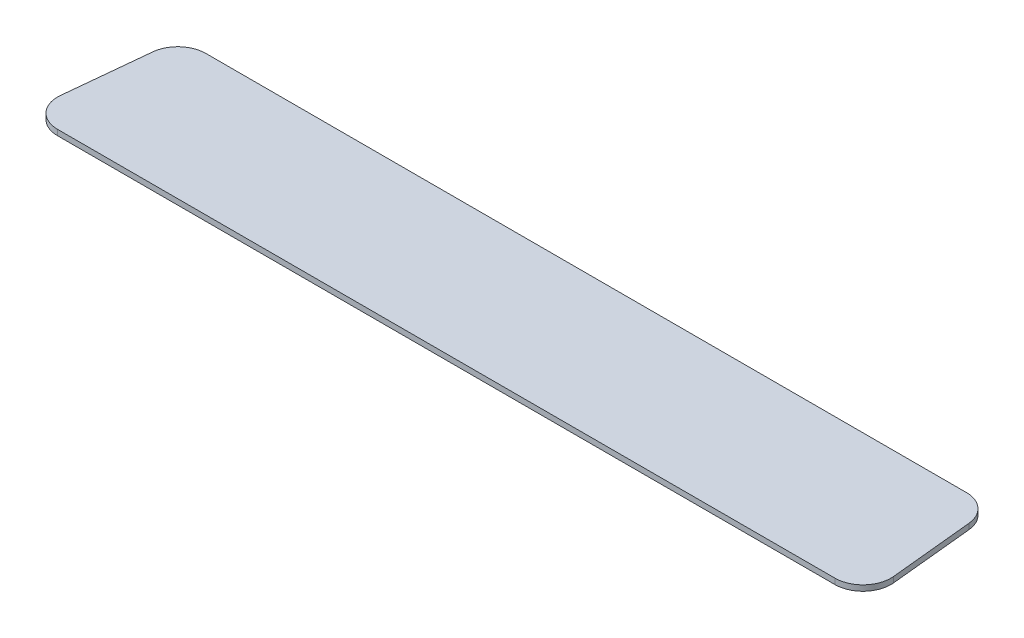
ISO-10303-21;
HEADER;
FILE_DESCRIPTION(('STEP AP214'),'2;1');
FILE_NAME('part.step','',(''),(''),'','','');
FILE_SCHEMA(('AUTOMOTIVE_DESIGN { 1 0 10303 214 1 1 1 1 }'));
ENDSEC;
DATA;
#1=APPLICATION_CONTEXT('core data for automotive mechanical design processes');
#2=APPLICATION_PROTOCOL_DEFINITION('international standard','automotive_design',2000,#1);
#3=PRODUCT_CONTEXT('',#1,'mechanical');
#4=PRODUCT('Part','Part','',(#3));
#5=PRODUCT_RELATED_PRODUCT_CATEGORY('part','',(#4));
#6=PRODUCT_DEFINITION_FORMATION('','',#4);
#7=PRODUCT_DEFINITION_CONTEXT('part definition',#1,'design');
#8=PRODUCT_DEFINITION('design','',#6,#7);
#9=PRODUCT_DEFINITION_SHAPE('','',#8);
#10=(LENGTH_UNIT() NAMED_UNIT(*) SI_UNIT(.MILLI.,.METRE.));
#11=(NAMED_UNIT(*) PLANE_ANGLE_UNIT() SI_UNIT($,.RADIAN.));
#12=(NAMED_UNIT(*) SI_UNIT($,.STERADIAN.) SOLID_ANGLE_UNIT());
#13=UNCERTAINTY_MEASURE_WITH_UNIT(LENGTH_MEASURE(1.E-05),#10,'distance_accuracy_value','');
#14=(GEOMETRIC_REPRESENTATION_CONTEXT(3) GLOBAL_UNCERTAINTY_ASSIGNED_CONTEXT((#13)) GLOBAL_UNIT_ASSIGNED_CONTEXT((#10,
#11,#12)) REPRESENTATION_CONTEXT('',''));
#15=CARTESIAN_POINT('',(0.,0.,0.));
#16=DIRECTION('',(0.,0.,1.));
#17=DIRECTION('',(1.,0.,0.));
#18=AXIS2_PLACEMENT_3D('',#15,#16,#17);
#19=CARTESIAN_POINT('',(138.950124378879,2.,-10.));
#20=DIRECTION('',(0.,-1.,0.));
#21=DIRECTION('',(0.,0.,-1.));
#22=AXIS2_PLACEMENT_3D('',#19,#20,#21);
#23=CYLINDRICAL_SURFACE('',#22,10.);
#24=CARTESIAN_POINT('',(138.950124378879,0.,-10.));
#25=DIRECTION('',(0.,1.,0.));
#26=DIRECTION('',(0.,0.,1.));
#27=AXIS2_PLACEMENT_3D('',#24,#25,#26);
#28=CIRCLE('',#27,10.);
#29=CARTESIAN_POINT('',(138.950124378879,0.,0.));
#30=VERTEX_POINT('',#29);
#31=CARTESIAN_POINT('',(148.900496280979,0.,-10.9950371902101));
#32=VERTEX_POINT('',#31);
#33=EDGE_CURVE('E146',#30,#32,#28,.T.);
#34=ORIENTED_EDGE('',*,*,#33,.T.);
#35=DIRECTION('',(0.,-1.,0.));
#36=VECTOR('',#35,1.);
#37=CARTESIAN_POINT('',(148.900496280979,2.,-10.9950371902101));
#38=LINE('',#37,#36);
#39=CARTESIAN_POINT('',(148.900496280979,2.,-10.9950371902101));
#40=VERTEX_POINT('',#39);
#41=EDGE_CURVE('E11',#40,#32,#38,.T.);
#42=ORIENTED_EDGE('',*,*,#41,.F.);
#43=CARTESIAN_POINT('',(138.950124378879,2.,-10.));
#44=DIRECTION('',(0.,1.,0.));
#45=DIRECTION('',(0.,0.,1.));
#46=AXIS2_PLACEMENT_3D('',#43,#44,#45);
#47=CIRCLE('',#46,10.);
#48=CARTESIAN_POINT('',(138.950124378879,2.,0.));
#49=VERTEX_POINT('',#48);
#50=EDGE_CURVE('E168',#49,#40,#47,.T.);
#51=ORIENTED_EDGE('',*,*,#50,.F.);
#52=DIRECTION('',(0.,-1.,0.));
#53=VECTOR('',#52,1.);
#54=CARTESIAN_POINT('',(138.950124378879,2.,0.));
#55=LINE('',#54,#53);
#56=EDGE_CURVE('E142',#49,#30,#55,.T.);
#57=ORIENTED_EDGE('',*,*,#56,.T.);
#58=EDGE_LOOP('',(#34,#42,#51,#57));
#59=FACE_BOUND('',#58,.T.);
#60=ADVANCED_FACE('F45',(#59),#23,.T.);
#61=CARTESIAN_POINT('',(145.900496280979,2.,-40.9950371902099));
#62=DIRECTION('',(-0.995037190209989,0.,0.0995037190209986));
#63=DIRECTION('',(0.0995037190209986,0.,0.995037190209989));
#64=AXIS2_PLACEMENT_3D('',#61,#62,#63);
#65=PLANE('',#64);
#66=DIRECTION('',(-0.0995037190209985,0.,-0.995037190209989));
#67=VECTOR('',#66,1.);
#68=CARTESIAN_POINT('',(145.900496280979,0.,-40.9950371902099));
#69=LINE('',#68,#67);
#70=CARTESIAN_POINT('',(145.900496280979,0.,-40.9950371902099));
#71=VERTEX_POINT('',#70);
#72=EDGE_CURVE('E150',#32,#71,#69,.T.);
#73=ORIENTED_EDGE('',*,*,#72,.T.);
#74=DIRECTION('',(0.,-1.,0.));
#75=VECTOR('',#74,1.);
#76=CARTESIAN_POINT('',(145.900496280979,2.,-40.9950371902099));
#77=LINE('',#76,#75);
#78=CARTESIAN_POINT('',(145.900496280979,2.,-40.9950371902099));
#79=VERTEX_POINT('',#78);
#80=EDGE_CURVE('E54',#79,#71,#77,.T.);
#81=ORIENTED_EDGE('',*,*,#80,.F.);
#82=DIRECTION('',(-0.0995037190209985,0.,-0.995037190209989));
#83=VECTOR('',#82,1.);
#84=CARTESIAN_POINT('',(145.900496280979,2.,-40.9950371902099));
#85=LINE('',#84,#83);
#86=EDGE_CURVE('E105',#40,#79,#85,.T.);
#87=ORIENTED_EDGE('',*,*,#86,.F.);
#88=ORIENTED_EDGE('',*,*,#41,.T.);
#89=EDGE_LOOP('',(#73,#81,#87,#88));
#90=FACE_BOUND('',#89,.T.);
#91=ADVANCED_FACE('F214',(#90),#65,.F.);
#92=CARTESIAN_POINT('',(135.950124378879,2.,-40.));
#93=DIRECTION('',(0.,-1.,0.));
#94=DIRECTION('',(0.,0.,-1.));
#95=AXIS2_PLACEMENT_3D('',#92,#93,#94);
#96=CYLINDRICAL_SURFACE('',#95,10.);
#97=CARTESIAN_POINT('',(135.950124378879,0.,-40.));
#98=DIRECTION('',(0.,1.,0.));
#99=DIRECTION('',(0.,0.,-1.));
#100=AXIS2_PLACEMENT_3D('',#97,#98,#99);
#101=CIRCLE('',#100,10.);
#102=CARTESIAN_POINT('',(135.950124378879,0.,-50.));
#103=VERTEX_POINT('',#102);
#104=EDGE_CURVE('E153',#71,#103,#101,.T.);
#105=ORIENTED_EDGE('',*,*,#104,.T.);
#106=DIRECTION('',(0.,-1.,0.));
#107=VECTOR('',#106,1.);
#108=CARTESIAN_POINT('',(135.950124378879,2.,-50.));
#109=LINE('',#108,#107);
#110=CARTESIAN_POINT('',(135.950124378879,2.,-50.));
#111=VERTEX_POINT('',#110);
#112=EDGE_CURVE('E179',#111,#103,#109,.T.);
#113=ORIENTED_EDGE('',*,*,#112,.F.);
#114=CARTESIAN_POINT('',(135.950124378879,2.,-40.));
#115=DIRECTION('',(0.,1.,0.));
#116=DIRECTION('',(0.,0.,-1.));
#117=AXIS2_PLACEMENT_3D('',#114,#115,#116);
#118=CIRCLE('',#117,10.);
#119=EDGE_CURVE('E189',#79,#111,#118,.T.);
#120=ORIENTED_EDGE('',*,*,#119,.F.);
#121=ORIENTED_EDGE('',*,*,#80,.T.);
#122=EDGE_LOOP('',(#105,#113,#120,#121));
#123=FACE_BOUND('',#122,.T.);
#124=ADVANCED_FACE('F187',(#123),#96,.T.);
#125=CARTESIAN_POINT('',(-135.950124378879,2.,-50.));
#126=DIRECTION('',(0.,0.,1.));
#127=DIRECTION('',(1.,0.,0.));
#128=AXIS2_PLACEMENT_3D('',#125,#126,#127);
#129=PLANE('',#128);
#130=DIRECTION('',(-1.,0.,0.));
#131=VECTOR('',#130,1.);
#132=CARTESIAN_POINT('',(-135.950124378879,0.,-50.));
#133=LINE('',#132,#131);
#134=CARTESIAN_POINT('',(-135.950124378879,0.,-50.));
#135=VERTEX_POINT('',#134);
#136=EDGE_CURVE('E156',#103,#135,#133,.T.);
#137=ORIENTED_EDGE('',*,*,#136,.T.);
#138=DIRECTION('',(0.,-1.,0.));
#139=VECTOR('',#138,1.);
#140=CARTESIAN_POINT('',(-135.950124378879,2.,-50.));
#141=LINE('',#140,#139);
#142=CARTESIAN_POINT('',(-135.950124378879,2.,-50.));
#143=VERTEX_POINT('',#142);
#144=EDGE_CURVE('E175',#143,#135,#141,.T.);
#145=ORIENTED_EDGE('',*,*,#144,.F.);
#146=DIRECTION('',(-1.,0.,0.));
#147=VECTOR('',#146,1.);
#148=CARTESIAN_POINT('',(-135.950124378879,2.,-50.));
#149=LINE('',#148,#147);
#150=EDGE_CURVE('E202',#111,#143,#149,.T.);
#151=ORIENTED_EDGE('',*,*,#150,.F.);
#152=ORIENTED_EDGE('',*,*,#112,.T.);
#153=EDGE_LOOP('',(#137,#145,#151,#152));
#154=FACE_BOUND('',#153,.T.);
#155=ADVANCED_FACE('F197',(#154),#129,.F.);
#156=CARTESIAN_POINT('',(-135.950124378879,2.,-40.));
#157=DIRECTION('',(0.,-1.,0.));
#158=DIRECTION('',(0.,0.,-1.));
#159=AXIS2_PLACEMENT_3D('',#156,#157,#158);
#160=CYLINDRICAL_SURFACE('',#159,10.);
#161=CARTESIAN_POINT('',(-135.950124378879,0.,-40.));
#162=DIRECTION('',(0.,1.,0.));
#163=DIRECTION('',(0.,0.,1.));
#164=AXIS2_PLACEMENT_3D('',#161,#162,#163);
#165=CIRCLE('',#164,10.);
#166=CARTESIAN_POINT('',(-145.900496280979,0.,-40.9950371902099));
#167=VERTEX_POINT('',#166);
#168=EDGE_CURVE('E159',#135,#167,#165,.T.);
#169=ORIENTED_EDGE('',*,*,#168,.T.);
#170=DIRECTION('',(0.,-1.,0.));
#171=VECTOR('',#170,1.);
#172=CARTESIAN_POINT('',(-145.900496280979,2.,-40.9950371902099));
#173=LINE('',#172,#171);
#174=CARTESIAN_POINT('',(-145.900496280979,2.,-40.9950371902099));
#175=VERTEX_POINT('',#174);
#176=EDGE_CURVE('E135',#175,#167,#173,.T.);
#177=ORIENTED_EDGE('',*,*,#176,.F.);
#178=CARTESIAN_POINT('',(-135.950124378879,2.,-40.));
#179=DIRECTION('',(0.,1.,0.));
#180=DIRECTION('',(0.,0.,1.));
#181=AXIS2_PLACEMENT_3D('',#178,#179,#180);
#182=CIRCLE('',#181,10.);
#183=EDGE_CURVE('E124',#143,#175,#182,.T.);
#184=ORIENTED_EDGE('',*,*,#183,.F.);
#185=ORIENTED_EDGE('',*,*,#144,.T.);
#186=EDGE_LOOP('',(#169,#177,#184,#185));
#187=FACE_BOUND('',#186,.T.);
#188=ADVANCED_FACE('F200',(#187),#160,.T.);
#189=CARTESIAN_POINT('',(-145.900496280979,2.,-40.9950371902099));
#190=DIRECTION('',(0.995037190209989,0.,0.0995037190209985));
#191=DIRECTION('',(0.0995037190209985,0.,-0.995037190209989));
#192=AXIS2_PLACEMENT_3D('',#189,#190,#191);
#193=PLANE('',#192);
#194=DIRECTION('',(-0.0995037190209985,0.,0.995037190209989));
#195=VECTOR('',#194,1.);
#196=CARTESIAN_POINT('',(-145.900496280979,0.,-40.9950371902099));
#197=LINE('',#196,#195);
#198=CARTESIAN_POINT('',(-148.900496280979,0.,-10.9950371902101));
#199=VERTEX_POINT('',#198);
#200=EDGE_CURVE('E133',#167,#199,#197,.T.);
#201=ORIENTED_EDGE('',*,*,#200,.T.);
#202=DIRECTION('',(0.,-1.,0.));
#203=VECTOR('',#202,1.);
#204=CARTESIAN_POINT('',(-148.900496280979,2.,-10.9950371902101));
#205=LINE('',#204,#203);
#206=CARTESIAN_POINT('',(-148.900496280979,2.,-10.9950371902101));
#207=VERTEX_POINT('',#206);
#208=EDGE_CURVE('E130',#207,#199,#205,.T.);
#209=ORIENTED_EDGE('',*,*,#208,.F.);
#210=DIRECTION('',(-0.0995037190209985,0.,0.995037190209989));
#211=VECTOR('',#210,1.);
#212=CARTESIAN_POINT('',(-145.900496280979,2.,-40.9950371902099));
#213=LINE('',#212,#211);
#214=EDGE_CURVE('E118',#175,#207,#213,.T.);
#215=ORIENTED_EDGE('',*,*,#214,.F.);
#216=ORIENTED_EDGE('',*,*,#176,.T.);
#217=EDGE_LOOP('',(#201,#209,#215,#216));
#218=FACE_BOUND('',#217,.T.);
#219=ADVANCED_FACE('F131',(#218),#193,.F.);
#220=CARTESIAN_POINT('',(-138.950124378879,2.,-10.));
#221=DIRECTION('',(0.,-1.,0.));
#222=DIRECTION('',(0.,0.,-1.));
#223=AXIS2_PLACEMENT_3D('',#220,#221,#222);
#224=CYLINDRICAL_SURFACE('',#223,10.);
#225=CARTESIAN_POINT('',(-138.950124378879,0.,-10.));
#226=DIRECTION('',(0.,1.,0.));
#227=DIRECTION('',(0.,0.,-1.));
#228=AXIS2_PLACEMENT_3D('',#225,#226,#227);
#229=CIRCLE('',#228,10.);
#230=CARTESIAN_POINT('',(-138.950124378879,0.,0.));
#231=VERTEX_POINT('',#230);
#232=EDGE_CURVE('E91',#199,#231,#229,.T.);
#233=ORIENTED_EDGE('',*,*,#232,.T.);
#234=DIRECTION('',(0.,-1.,0.));
#235=VECTOR('',#234,1.);
#236=CARTESIAN_POINT('',(-138.950124378879,2.,0.));
#237=LINE('',#236,#235);
#238=CARTESIAN_POINT('',(-138.950124378879,2.,0.));
#239=VERTEX_POINT('',#238);
#240=EDGE_CURVE('E136',#239,#231,#237,.T.);
#241=ORIENTED_EDGE('',*,*,#240,.F.);
#242=CARTESIAN_POINT('',(-138.950124378879,2.,-10.));
#243=DIRECTION('',(0.,1.,0.));
#244=DIRECTION('',(0.,0.,-1.));
#245=AXIS2_PLACEMENT_3D('',#242,#243,#244);
#246=CIRCLE('',#245,10.);
#247=EDGE_CURVE('E122',#207,#239,#246,.T.);
#248=ORIENTED_EDGE('',*,*,#247,.F.);
#249=ORIENTED_EDGE('',*,*,#208,.T.);
#250=EDGE_LOOP('',(#233,#241,#248,#249));
#251=FACE_BOUND('',#250,.T.);
#252=ADVANCED_FACE('F138',(#251),#224,.T.);
#253=CARTESIAN_POINT('',(-138.950124378879,2.,0.));
#254=DIRECTION('',(0.,0.,-1.));
#255=DIRECTION('',(-1.,0.,0.));
#256=AXIS2_PLACEMENT_3D('',#253,#254,#255);
#257=PLANE('',#256);
#258=DIRECTION('',(1.,0.,0.));
#259=VECTOR('',#258,1.);
#260=CARTESIAN_POINT('',(-138.950124378879,0.,0.));
#261=LINE('',#260,#259);
#262=EDGE_CURVE('E97',#231,#30,#261,.T.);
#263=ORIENTED_EDGE('',*,*,#262,.T.);
#264=ORIENTED_EDGE('',*,*,#56,.F.);
#265=DIRECTION('',(1.,0.,0.));
#266=VECTOR('',#265,1.);
#267=CARTESIAN_POINT('',(-138.950124378879,2.,0.));
#268=LINE('',#267,#266);
#269=EDGE_CURVE('E62',#239,#49,#268,.T.);
#270=ORIENTED_EDGE('',*,*,#269,.F.);
#271=ORIENTED_EDGE('',*,*,#240,.T.);
#272=EDGE_LOOP('',(#263,#264,#270,#271));
#273=FACE_BOUND('',#272,.T.);
#274=ADVANCED_FACE('F230',(#273),#257,.F.);
#275=CARTESIAN_POINT('',(138.950124378879,2.,-10.));
#276=DIRECTION('',(0.,1.,0.));
#277=DIRECTION('',(0.,0.,1.));
#278=AXIS2_PLACEMENT_3D('',#275,#276,#277);
#279=PLANE('',#278);
#280=ORIENTED_EDGE('',*,*,#50,.T.);
#281=ORIENTED_EDGE('',*,*,#86,.T.);
#282=ORIENTED_EDGE('',*,*,#119,.T.);
#283=ORIENTED_EDGE('',*,*,#150,.T.);
#284=ORIENTED_EDGE('',*,*,#183,.T.);
#285=ORIENTED_EDGE('',*,*,#214,.T.);
#286=ORIENTED_EDGE('',*,*,#247,.T.);
#287=ORIENTED_EDGE('',*,*,#269,.T.);
#288=EDGE_LOOP('',(#280,#281,#282,#283,#284,#285,#286,#287));
#289=FACE_BOUND('',#288,.T.);
#290=ADVANCED_FACE('F120',(#289),#279,.T.);
#291=CARTESIAN_POINT('',(138.950124378879,0.,-10.));
#292=DIRECTION('',(0.,1.,0.));
#293=DIRECTION('',(0.,0.,1.));
#294=AXIS2_PLACEMENT_3D('',#291,#292,#293);
#295=PLANE('',#294);
#296=ORIENTED_EDGE('',*,*,#33,.F.);
#297=ORIENTED_EDGE('',*,*,#262,.F.);
#298=ORIENTED_EDGE('',*,*,#232,.F.);
#299=ORIENTED_EDGE('',*,*,#200,.F.);
#300=ORIENTED_EDGE('',*,*,#168,.F.);
#301=ORIENTED_EDGE('',*,*,#136,.F.);
#302=ORIENTED_EDGE('',*,*,#104,.F.);
#303=ORIENTED_EDGE('',*,*,#72,.F.);
#304=EDGE_LOOP('',(#296,#297,#298,#299,#300,#301,#302,#303));
#305=FACE_BOUND('',#304,.T.);
#306=ADVANCED_FACE('F193',(#305),#295,.F.);
#307=CLOSED_SHELL('',(#60,#91,#124,#155,#188,#219,#252,#274,#290,#306));
#308=MANIFOLD_SOLID_BREP('B2',#307);
#309=ADVANCED_BREP_SHAPE_REPRESENTATION('',(#18,#308),#14);
#310=SHAPE_DEFINITION_REPRESENTATION(#9,#309);
ENDSEC;
END-ISO-10303-21;
